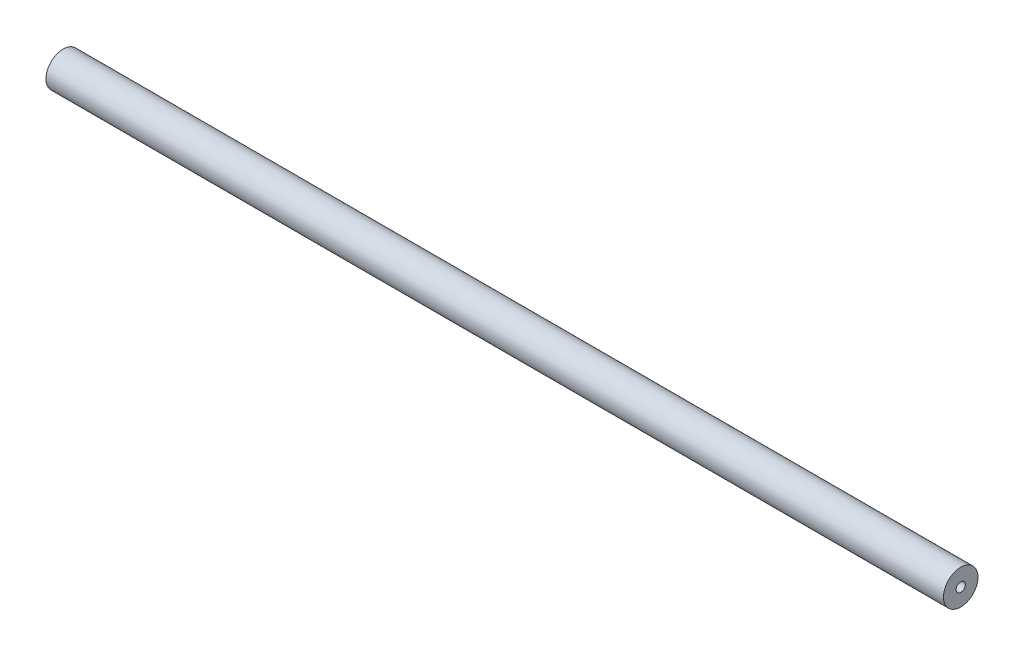
ISO-10303-21;
HEADER;
FILE_DESCRIPTION(('STEP AP214'),'2;1');
FILE_NAME('part.step','',(''),(''),'','','');
FILE_SCHEMA(('AUTOMOTIVE_DESIGN { 1 0 10303 214 1 1 1 1 }'));
ENDSEC;
DATA;
#1=APPLICATION_CONTEXT('core data for automotive mechanical design processes');
#2=APPLICATION_PROTOCOL_DEFINITION('international standard','automotive_design',2000,#1);
#3=PRODUCT_CONTEXT('',#1,'mechanical');
#4=PRODUCT('Part','Part','',(#3));
#5=PRODUCT_RELATED_PRODUCT_CATEGORY('part','',(#4));
#6=PRODUCT_DEFINITION_FORMATION('','',#4);
#7=PRODUCT_DEFINITION_CONTEXT('part definition',#1,'design');
#8=PRODUCT_DEFINITION('design','',#6,#7);
#9=PRODUCT_DEFINITION_SHAPE('','',#8);
#10=(LENGTH_UNIT() NAMED_UNIT(*) SI_UNIT(.MILLI.,.METRE.));
#11=(NAMED_UNIT(*) PLANE_ANGLE_UNIT() SI_UNIT($,.RADIAN.));
#12=(NAMED_UNIT(*) SI_UNIT($,.STERADIAN.) SOLID_ANGLE_UNIT());
#13=UNCERTAINTY_MEASURE_WITH_UNIT(LENGTH_MEASURE(1.E-05),#10,'distance_accuracy_value','');
#14=(GEOMETRIC_REPRESENTATION_CONTEXT(3) GLOBAL_UNCERTAINTY_ASSIGNED_CONTEXT((#13)) GLOBAL_UNIT_ASSIGNED_CONTEXT((#10,
#11,#12)) REPRESENTATION_CONTEXT('',''));
#15=CARTESIAN_POINT('',(0.,0.,0.));
#16=DIRECTION('',(0.,0.,1.));
#17=DIRECTION('',(1.,0.,0.));
#18=AXIS2_PLACEMENT_3D('',#15,#16,#17);
#19=CARTESIAN_POINT('',(-495.3,0.,0.));
#20=DIRECTION('',(1.,0.,0.));
#21=DIRECTION('',(0.,0.,-1.));
#22=AXIS2_PLACEMENT_3D('',#19,#20,#21);
#23=CYLINDRICAL_SURFACE('',#22,9.525);
#24=CARTESIAN_POINT('',(-495.3,0.,0.));
#25=DIRECTION('',(1.,0.,0.));
#26=DIRECTION('',(0.,0.,-1.));
#27=AXIS2_PLACEMENT_3D('',#24,#25,#26);
#28=CIRCLE('',#27,9.525);
#29=CARTESIAN_POINT('',(-495.3,0.,-9.525));
#30=VERTEX_POINT('',#29);
#31=EDGE_CURVE('E11',#30,#30,#28,.T.);
#32=ORIENTED_EDGE('',*,*,#31,.T.);
#33=EDGE_LOOP('',(#32));
#34=FACE_BOUND('',#33,.T.);
#35=CARTESIAN_POINT('',(0.,0.,0.));
#36=DIRECTION('',(1.,0.,0.));
#37=DIRECTION('',(0.,0.,-1.));
#38=AXIS2_PLACEMENT_3D('',#35,#36,#37);
#39=CIRCLE('',#38,9.525);
#40=CARTESIAN_POINT('',(0.,0.,-9.525));
#41=VERTEX_POINT('',#40);
#42=EDGE_CURVE('E45',#41,#41,#39,.T.);
#43=ORIENTED_EDGE('',*,*,#42,.F.);
#44=EDGE_LOOP('',(#43));
#45=FACE_BOUND('',#44,.T.);
#46=ADVANCED_FACE('F42',(#34,#45),#23,.T.);
#47=CARTESIAN_POINT('',(-495.3,0.,0.));
#48=DIRECTION('',(1.,0.,0.));
#49=DIRECTION('',(0.,0.,-1.));
#50=AXIS2_PLACEMENT_3D('',#47,#48,#49);
#51=PLANE('',#50);
#52=CARTESIAN_POINT('',(-495.3,0.,0.));
#53=DIRECTION('',(-1.,0.,0.));
#54=DIRECTION('',(0.,0.,1.));
#55=AXIS2_PLACEMENT_3D('',#52,#53,#54);
#56=CIRCLE('',#55,2.55269999999999);
#57=CARTESIAN_POINT('',(-495.3,0.,2.55269999999999));
#58=VERTEX_POINT('',#57);
#59=EDGE_CURVE('E68',#58,#58,#56,.T.);
#60=ORIENTED_EDGE('',*,*,#59,.F.);
#61=EDGE_LOOP('',(#60));
#62=FACE_BOUND('',#61,.T.);
#63=ORIENTED_EDGE('',*,*,#31,.F.);
#64=EDGE_LOOP('',(#63));
#65=FACE_BOUND('',#64,.T.);
#66=ADVANCED_FACE('F92',(#62,#65),#51,.F.);
#67=CARTESIAN_POINT('',(0.,0.,0.));
#68=DIRECTION('',(1.,0.,0.));
#69=DIRECTION('',(0.,0.,-1.));
#70=AXIS2_PLACEMENT_3D('',#67,#68,#69);
#71=PLANE('',#70);
#72=CARTESIAN_POINT('',(0.,0.,0.));
#73=DIRECTION('',(1.,0.,0.));
#74=DIRECTION('',(0.,0.,-1.));
#75=AXIS2_PLACEMENT_3D('',#72,#73,#74);
#76=CIRCLE('',#75,2.55269999999999);
#77=CARTESIAN_POINT('',(0.,0.,-2.55269999999999));
#78=VERTEX_POINT('',#77);
#79=EDGE_CURVE('E67',#78,#78,#76,.T.);
#80=ORIENTED_EDGE('',*,*,#79,.F.);
#81=EDGE_LOOP('',(#80));
#82=FACE_BOUND('',#81,.T.);
#83=ORIENTED_EDGE('',*,*,#42,.T.);
#84=EDGE_LOOP('',(#83));
#85=FACE_BOUND('',#84,.T.);
#86=ADVANCED_FACE('F89',(#82,#85),#71,.T.);
#87=CARTESIAN_POINT('',(-16.51,0.,0.));
#88=DIRECTION('',(1.,0.,0.));
#89=DIRECTION('',(0.,0.,-1.));
#90=AXIS2_PLACEMENT_3D('',#87,#88,#89);
#91=CONICAL_SURFACE('',#90,2.55269999999999,1.02974425867665);
#92=CARTESIAN_POINT('',(-18.0438169021916,0.,0.));
#93=VERTEX_POINT('',#92);
#94=VERTEX_LOOP('',#93);
#95=FACE_BOUND('',#94,.T.);
#96=CARTESIAN_POINT('',(-16.51,0.,0.));
#97=DIRECTION('',(1.,0.,0.));
#98=DIRECTION('',(0.,0.,-1.));
#99=AXIS2_PLACEMENT_3D('',#96,#97,#98);
#100=CIRCLE('',#99,2.55269999999999);
#101=CARTESIAN_POINT('',(-16.51,0.,-2.55269999999999));
#102=VERTEX_POINT('',#101);
#103=EDGE_CURVE('E74',#102,#102,#100,.T.);
#104=ORIENTED_EDGE('',*,*,#103,.T.);
#105=EDGE_LOOP('',(#104));
#106=FACE_BOUND('',#105,.T.);
#107=ADVANCED_FACE('F104',(#95,#106),#91,.F.);
#108=CARTESIAN_POINT('',(0.,0.,0.));
#109=DIRECTION('',(1.,0.,0.));
#110=DIRECTION('',(0.,0.,-1.));
#111=AXIS2_PLACEMENT_3D('',#108,#109,#110);
#112=CYLINDRICAL_SURFACE('',#111,2.55269999999999);
#113=ORIENTED_EDGE('',*,*,#103,.F.);
#114=EDGE_LOOP('',(#113));
#115=FACE_BOUND('',#114,.T.);
#116=ORIENTED_EDGE('',*,*,#79,.T.);
#117=EDGE_LOOP('',(#116));
#118=FACE_BOUND('',#117,.T.);
#119=ADVANCED_FACE('F60',(#115,#118),#112,.F.);
#120=CARTESIAN_POINT('',(-478.79,0.,0.));
#121=DIRECTION('',(-1.,0.,0.));
#122=DIRECTION('',(0.,0.,1.));
#123=AXIS2_PLACEMENT_3D('',#120,#121,#122);
#124=CONICAL_SURFACE('',#123,2.55269999999999,1.02974425867666);
#125=CARTESIAN_POINT('',(-477.256183097808,0.,0.));
#126=VERTEX_POINT('',#125);
#127=VERTEX_LOOP('',#126);
#128=FACE_BOUND('',#127,.T.);
#129=CARTESIAN_POINT('',(-478.79,0.,0.));
#130=DIRECTION('',(-1.,0.,0.));
#131=DIRECTION('',(0.,0.,1.));
#132=AXIS2_PLACEMENT_3D('',#129,#130,#131);
#133=CIRCLE('',#132,2.55269999999999);
#134=CARTESIAN_POINT('',(-478.79,0.,2.55269999999999));
#135=VERTEX_POINT('',#134);
#136=EDGE_CURVE('E64',#135,#135,#133,.T.);
#137=ORIENTED_EDGE('',*,*,#136,.T.);
#138=EDGE_LOOP('',(#137));
#139=FACE_BOUND('',#138,.T.);
#140=ADVANCED_FACE('F56',(#128,#139),#124,.F.);
#141=CARTESIAN_POINT('',(-495.3,0.,0.));
#142=DIRECTION('',(-1.,0.,0.));
#143=DIRECTION('',(0.,0.,1.));
#144=AXIS2_PLACEMENT_3D('',#141,#142,#143);
#145=CYLINDRICAL_SURFACE('',#144,2.55269999999999);
#146=ORIENTED_EDGE('',*,*,#136,.F.);
#147=EDGE_LOOP('',(#146));
#148=FACE_BOUND('',#147,.T.);
#149=ORIENTED_EDGE('',*,*,#59,.T.);
#150=EDGE_LOOP('',(#149));
#151=FACE_BOUND('',#150,.T.);
#152=ADVANCED_FACE('F59',(#148,#151),#145,.F.);
#153=CLOSED_SHELL('',(#46,#66,#86,#107,#119,#140,#152));
#154=MANIFOLD_SOLID_BREP('B2',#153);
#155=ADVANCED_BREP_SHAPE_REPRESENTATION('',(#18,#154),#14);
#156=SHAPE_DEFINITION_REPRESENTATION(#9,#155);
ENDSEC;
END-ISO-10303-21;
